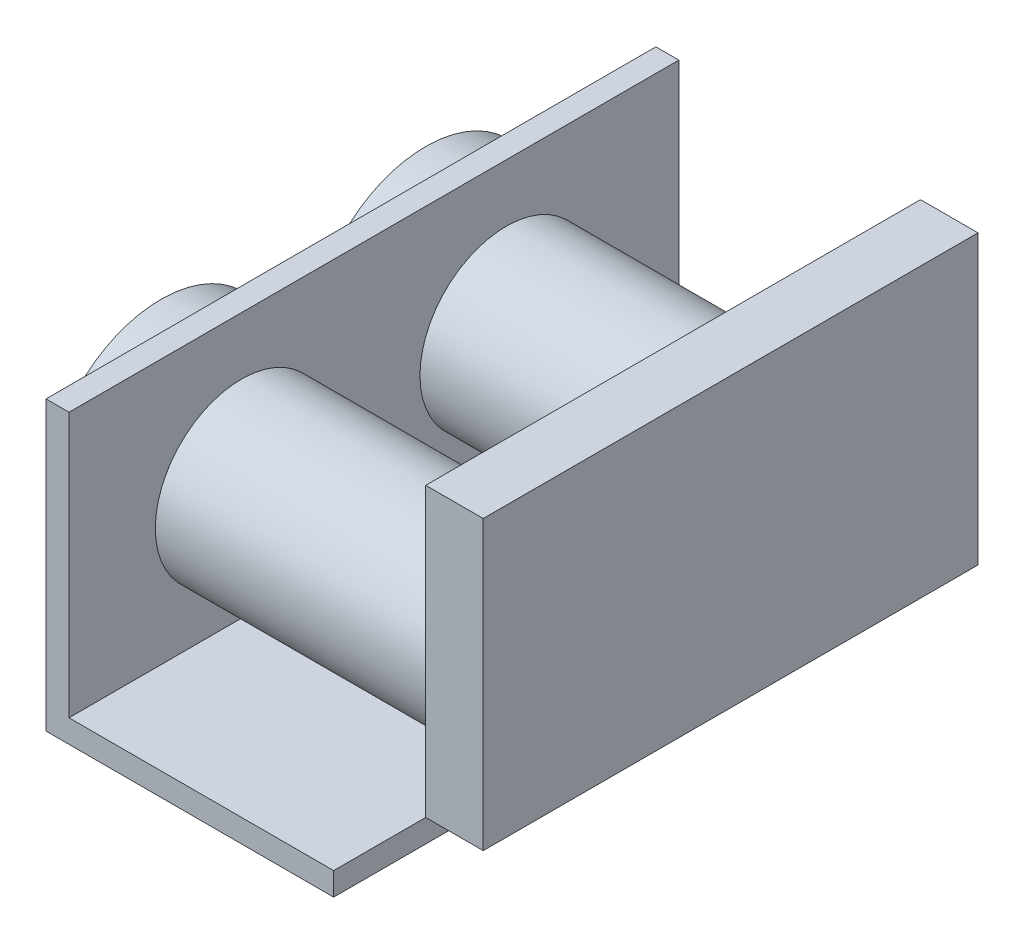
ISO-10303-21;
HEADER;
FILE_DESCRIPTION(('STEP AP214'),'2;1');
FILE_NAME('part.step','',(''),(''),'','','');
FILE_SCHEMA(('AUTOMOTIVE_DESIGN { 1 0 10303 214 1 1 1 1 }'));
ENDSEC;
DATA;
#1=APPLICATION_CONTEXT('core data for automotive mechanical design processes');
#2=APPLICATION_PROTOCOL_DEFINITION('international standard','automotive_design',2000,#1);
#3=PRODUCT_CONTEXT('',#1,'mechanical');
#4=PRODUCT('Part','Part','',(#3));
#5=PRODUCT_RELATED_PRODUCT_CATEGORY('part','',(#4));
#6=PRODUCT_DEFINITION_FORMATION('','',#4);
#7=PRODUCT_DEFINITION_CONTEXT('part definition',#1,'design');
#8=PRODUCT_DEFINITION('design','',#6,#7);
#9=PRODUCT_DEFINITION_SHAPE('','',#8);
#10=(LENGTH_UNIT() NAMED_UNIT(*) SI_UNIT(.MILLI.,.METRE.));
#11=(NAMED_UNIT(*) PLANE_ANGLE_UNIT() SI_UNIT($,.RADIAN.));
#12=(NAMED_UNIT(*) SI_UNIT($,.STERADIAN.) SOLID_ANGLE_UNIT());
#13=UNCERTAINTY_MEASURE_WITH_UNIT(LENGTH_MEASURE(1.E-05),#10,'distance_accuracy_value','');
#14=(GEOMETRIC_REPRESENTATION_CONTEXT(3) GLOBAL_UNCERTAINTY_ASSIGNED_CONTEXT((#13)) GLOBAL_UNIT_ASSIGNED_CONTEXT((#10,
#11,#12)) REPRESENTATION_CONTEXT('',''));
#15=CARTESIAN_POINT('',(0.,0.,0.));
#16=DIRECTION('',(0.,0.,1.));
#17=DIRECTION('',(1.,0.,0.));
#18=AXIS2_PLACEMENT_3D('',#15,#16,#17);
#19=CARTESIAN_POINT('',(0.,0.,53.));
#20=DIRECTION('',(-1.,0.,0.));
#21=DIRECTION('',(0.,0.,1.));
#22=AXIS2_PLACEMENT_3D('',#19,#20,#21);
#23=PLANE('',#22);
#24=CARTESIAN_POINT('',(0.,12.5,15.));
#25=DIRECTION('',(-1.,0.,0.));
#26=DIRECTION('',(0.,0.,1.));
#27=AXIS2_PLACEMENT_3D('',#24,#25,#26);
#28=CIRCLE('',#27,10.);
#29=CARTESIAN_POINT('',(0.,12.5,25.));
#30=VERTEX_POINT('',#29);
#31=EDGE_CURVE('E160',#30,#30,#28,.T.);
#32=ORIENTED_EDGE('',*,*,#31,.F.);
#33=EDGE_LOOP('',(#32));
#34=FACE_BOUND('',#33,.T.);
#35=DIRECTION('',(0.,1.,0.));
#36=VECTOR('',#35,1.);
#37=CARTESIAN_POINT('',(0.,0.,0.));
#38=LINE('',#37,#36);
#39=CARTESIAN_POINT('',(0.,0.,0.));
#40=VERTEX_POINT('',#39);
#41=CARTESIAN_POINT('',(0.,25.,0.));
#42=VERTEX_POINT('',#41);
#43=EDGE_CURVE('E192',#40,#42,#38,.T.);
#44=ORIENTED_EDGE('',*,*,#43,.F.);
#45=DIRECTION('',(0.,0.,-1.));
#46=VECTOR('',#45,1.);
#47=CARTESIAN_POINT('',(0.,0.,53.));
#48=LINE('',#47,#46);
#49=CARTESIAN_POINT('',(0.,0.,53.));
#50=VERTEX_POINT('',#49);
#51=EDGE_CURVE('E208',#50,#40,#48,.T.);
#52=ORIENTED_EDGE('',*,*,#51,.F.);
#53=DIRECTION('',(0.,1.,0.));
#54=VECTOR('',#53,1.);
#55=CARTESIAN_POINT('',(0.,0.,53.));
#56=LINE('',#55,#54);
#57=CARTESIAN_POINT('',(0.,25.,53.));
#58=VERTEX_POINT('',#57);
#59=EDGE_CURVE('E175',#50,#58,#56,.T.);
#60=ORIENTED_EDGE('',*,*,#59,.T.);
#61=DIRECTION('',(0.,0.,-1.));
#62=VECTOR('',#61,1.);
#63=CARTESIAN_POINT('',(0.,25.,53.));
#64=LINE('',#63,#62);
#65=EDGE_CURVE('E42',#58,#42,#64,.T.);
#66=ORIENTED_EDGE('',*,*,#65,.T.);
#67=EDGE_LOOP('',(#44,#52,#60,#66));
#68=FACE_BOUND('',#67,.T.);
#69=CARTESIAN_POINT('',(0.,12.5,38.));
#70=DIRECTION('',(-1.,0.,0.));
#71=DIRECTION('',(0.,0.,1.));
#72=AXIS2_PLACEMENT_3D('',#69,#70,#71);
#73=CIRCLE('',#72,10.);
#74=CARTESIAN_POINT('',(0.,12.5,48.));
#75=VERTEX_POINT('',#74);
#76=EDGE_CURVE('E156',#75,#75,#73,.T.);
#77=ORIENTED_EDGE('',*,*,#76,.F.);
#78=EDGE_LOOP('',(#77));
#79=FACE_BOUND('',#78,.T.);
#80=ADVANCED_FACE('F33',(#34,#68,#79),#23,.T.);
#81=CARTESIAN_POINT('',(2.,0.,53.));
#82=DIRECTION('',(-1.,0.,0.));
#83=DIRECTION('',(0.,0.,1.));
#84=AXIS2_PLACEMENT_3D('',#81,#82,#83);
#85=PLANE('',#84);
#86=CARTESIAN_POINT('',(2.,12.5,15.));
#87=DIRECTION('',(-1.,0.,0.));
#88=DIRECTION('',(0.,0.,1.));
#89=AXIS2_PLACEMENT_3D('',#86,#87,#88);
#90=CIRCLE('',#89,7.5);
#91=CARTESIAN_POINT('',(2.,12.5,22.5));
#92=VERTEX_POINT('',#91);
#93=EDGE_CURVE('E142',#92,#92,#90,.T.);
#94=ORIENTED_EDGE('',*,*,#93,.T.);
#95=EDGE_LOOP('',(#94));
#96=FACE_BOUND('',#95,.T.);
#97=CARTESIAN_POINT('',(2.,12.5,38.));
#98=DIRECTION('',(-1.,0.,0.));
#99=DIRECTION('',(0.,0.,1.));
#100=AXIS2_PLACEMENT_3D('',#97,#98,#99);
#101=CIRCLE('',#100,7.5);
#102=CARTESIAN_POINT('',(2.,12.5,45.5));
#103=VERTEX_POINT('',#102);
#104=EDGE_CURVE('E153',#103,#103,#101,.T.);
#105=ORIENTED_EDGE('',*,*,#104,.T.);
#106=EDGE_LOOP('',(#105));
#107=FACE_BOUND('',#106,.T.);
#108=DIRECTION('',(0.,1.,0.));
#109=VECTOR('',#108,1.);
#110=CARTESIAN_POINT('',(2.,0.,0.));
#111=LINE('',#110,#109);
#112=CARTESIAN_POINT('',(2.,2.,0.));
#113=VERTEX_POINT('',#112);
#114=CARTESIAN_POINT('',(2.,25.,0.));
#115=VERTEX_POINT('',#114);
#116=EDGE_CURVE('E166',#113,#115,#111,.T.);
#117=ORIENTED_EDGE('',*,*,#116,.T.);
#118=DIRECTION('',(0.,0.,-1.));
#119=VECTOR('',#118,1.);
#120=CARTESIAN_POINT('',(2.,25.,53.));
#121=LINE('',#120,#119);
#122=CARTESIAN_POINT('',(2.,25.,53.));
#123=VERTEX_POINT('',#122);
#124=EDGE_CURVE('E11',#123,#115,#121,.T.);
#125=ORIENTED_EDGE('',*,*,#124,.F.);
#126=DIRECTION('',(0.,1.,0.));
#127=VECTOR('',#126,1.);
#128=CARTESIAN_POINT('',(2.,0.,53.));
#129=LINE('',#128,#127);
#130=CARTESIAN_POINT('',(2.,2.,53.));
#131=VERTEX_POINT('',#130);
#132=EDGE_CURVE('E169',#131,#123,#129,.T.);
#133=ORIENTED_EDGE('',*,*,#132,.F.);
#134=DIRECTION('',(0.,0.,-1.));
#135=VECTOR('',#134,1.);
#136=CARTESIAN_POINT('',(2.,2.,53.));
#137=LINE('',#136,#135);
#138=EDGE_CURVE('E186',#131,#113,#137,.T.);
#139=ORIENTED_EDGE('',*,*,#138,.T.);
#140=EDGE_LOOP('',(#117,#125,#133,#139));
#141=FACE_BOUND('',#140,.T.);
#142=ADVANCED_FACE('F35',(#96,#107,#141),#85,.F.);
#143=CARTESIAN_POINT('',(0.,25.,53.));
#144=DIRECTION('',(0.,1.,0.));
#145=DIRECTION('',(0.,0.,1.));
#146=AXIS2_PLACEMENT_3D('',#143,#144,#145);
#147=PLANE('',#146);
#148=DIRECTION('',(1.,0.,0.));
#149=VECTOR('',#148,1.);
#150=CARTESIAN_POINT('',(0.,25.,0.));
#151=LINE('',#150,#149);
#152=EDGE_CURVE('E189',#42,#115,#151,.T.);
#153=ORIENTED_EDGE('',*,*,#152,.F.);
#154=ORIENTED_EDGE('',*,*,#65,.F.);
#155=DIRECTION('',(1.,0.,0.));
#156=VECTOR('',#155,1.);
#157=CARTESIAN_POINT('',(0.,25.,53.));
#158=LINE('',#157,#156);
#159=EDGE_CURVE('E171',#58,#123,#158,.T.);
#160=ORIENTED_EDGE('',*,*,#159,.T.);
#161=ORIENTED_EDGE('',*,*,#124,.T.);
#162=EDGE_LOOP('',(#153,#154,#160,#161));
#163=FACE_BOUND('',#162,.T.);
#164=ADVANCED_FACE('F217',(#163),#147,.T.);
#165=CARTESIAN_POINT('',(0.,0.,53.));
#166=DIRECTION('',(0.,-1.,0.));
#167=DIRECTION('',(0.,0.,-1.));
#168=AXIS2_PLACEMENT_3D('',#165,#166,#167);
#169=PLANE('',#168);
#170=CARTESIAN_POINT('',(15.,0.,26.5));
#171=DIRECTION('',(0.,-1.,0.));
#172=DIRECTION('',(0.,0.,-1.));
#173=AXIS2_PLACEMENT_3D('',#170,#171,#172);
#174=CIRCLE('',#173,1.5);
#175=CARTESIAN_POINT('',(15.,0.,25.));
#176=VERTEX_POINT('',#175);
#177=EDGE_CURVE('E268',#176,#176,#174,.T.);
#178=ORIENTED_EDGE('',*,*,#177,.F.);
#179=EDGE_LOOP('',(#178));
#180=FACE_BOUND('',#179,.T.);
#181=DIRECTION('',(-1.,0.,0.));
#182=VECTOR('',#181,1.);
#183=CARTESIAN_POINT('',(0.,0.,0.));
#184=LINE('',#183,#182);
#185=CARTESIAN_POINT('',(25.,0.,0.));
#186=VERTEX_POINT('',#185);
#187=EDGE_CURVE('E195',#186,#40,#184,.T.);
#188=ORIENTED_EDGE('',*,*,#187,.F.);
#189=DIRECTION('',(0.,0.,-1.));
#190=VECTOR('',#189,1.);
#191=CARTESIAN_POINT('',(25.,0.,53.));
#192=LINE('',#191,#190);
#193=CARTESIAN_POINT('',(25.,0.,53.));
#194=VERTEX_POINT('',#193);
#195=EDGE_CURVE('E206',#194,#186,#192,.T.);
#196=ORIENTED_EDGE('',*,*,#195,.F.);
#197=DIRECTION('',(-1.,0.,0.));
#198=VECTOR('',#197,1.);
#199=CARTESIAN_POINT('',(0.,0.,53.));
#200=LINE('',#199,#198);
#201=EDGE_CURVE('E178',#194,#50,#200,.T.);
#202=ORIENTED_EDGE('',*,*,#201,.T.);
#203=ORIENTED_EDGE('',*,*,#51,.T.);
#204=EDGE_LOOP('',(#188,#196,#202,#203));
#205=FACE_BOUND('',#204,.T.);
#206=ADVANCED_FACE('F226',(#180,#205),#169,.T.);
#207=CARTESIAN_POINT('',(25.,2.,53.));
#208=DIRECTION('',(1.,0.,0.));
#209=DIRECTION('',(0.,0.,-1.));
#210=AXIS2_PLACEMENT_3D('',#207,#208,#209);
#211=PLANE('',#210);
#212=DIRECTION('',(0.,-1.,0.));
#213=VECTOR('',#212,1.);
#214=CARTESIAN_POINT('',(25.,2.,0.));
#215=LINE('',#214,#213);
#216=CARTESIAN_POINT('',(25.,2.,0.));
#217=VERTEX_POINT('',#216);
#218=EDGE_CURVE('E198',#217,#186,#215,.T.);
#219=ORIENTED_EDGE('',*,*,#218,.F.);
#220=DIRECTION('',(0.,0.,-1.));
#221=VECTOR('',#220,1.);
#222=CARTESIAN_POINT('',(25.,2.,53.));
#223=LINE('',#222,#221);
#224=CARTESIAN_POINT('',(25.,2.,53.));
#225=VERTEX_POINT('',#224);
#226=EDGE_CURVE('E204',#225,#217,#223,.T.);
#227=ORIENTED_EDGE('',*,*,#226,.F.);
#228=DIRECTION('',(0.,-1.,0.));
#229=VECTOR('',#228,1.);
#230=CARTESIAN_POINT('',(25.,2.,53.));
#231=LINE('',#230,#229);
#232=EDGE_CURVE('E181',#225,#194,#231,.T.);
#233=ORIENTED_EDGE('',*,*,#232,.T.);
#234=ORIENTED_EDGE('',*,*,#195,.T.);
#235=EDGE_LOOP('',(#219,#227,#233,#234));
#236=FACE_BOUND('',#235,.T.);
#237=ADVANCED_FACE('F237',(#236),#211,.T.);
#238=CARTESIAN_POINT('',(0.,2.,53.));
#239=DIRECTION('',(0.,-1.,0.));
#240=DIRECTION('',(0.,0.,-1.));
#241=AXIS2_PLACEMENT_3D('',#238,#239,#240);
#242=PLANE('',#241);
#243=CARTESIAN_POINT('',(15.,2.,26.5));
#244=DIRECTION('',(0.,-1.,0.));
#245=DIRECTION('',(0.,0.,-1.));
#246=AXIS2_PLACEMENT_3D('',#243,#244,#245);
#247=CIRCLE('',#246,1.5);
#248=CARTESIAN_POINT('',(15.,2.,25.));
#249=VERTEX_POINT('',#248);
#250=EDGE_CURVE('E37',#249,#249,#247,.T.);
#251=ORIENTED_EDGE('',*,*,#250,.T.);
#252=EDGE_LOOP('',(#251));
#253=FACE_BOUND('',#252,.T.);
#254=DIRECTION('',(1.,0.,0.));
#255=VECTOR('',#254,1.);
#256=CARTESIAN_POINT('',(0.,2.,0.));
#257=LINE('',#256,#255);
#258=EDGE_CURVE('E172',#217,#113,#257,.F.);
#259=ORIENTED_EDGE('',*,*,#258,.T.);
#260=ORIENTED_EDGE('',*,*,#138,.F.);
#261=DIRECTION('',(1.,0.,0.));
#262=VECTOR('',#261,1.);
#263=CARTESIAN_POINT('',(0.,2.,53.));
#264=LINE('',#263,#262);
#265=EDGE_CURVE('E184',#225,#131,#264,.F.);
#266=ORIENTED_EDGE('',*,*,#265,.F.);
#267=ORIENTED_EDGE('',*,*,#226,.T.);
#268=EDGE_LOOP('',(#259,#260,#266,#267));
#269=FACE_BOUND('',#268,.T.);
#270=ADVANCED_FACE('F238',(#253,#269),#242,.F.);
#271=CARTESIAN_POINT('',(0.,0.,53.));
#272=DIRECTION('',(0.,0.,-1.));
#273=DIRECTION('',(-1.,0.,0.));
#274=AXIS2_PLACEMENT_3D('',#271,#272,#273);
#275=PLANE('',#274);
#276=ORIENTED_EDGE('',*,*,#132,.T.);
#277=ORIENTED_EDGE('',*,*,#159,.F.);
#278=ORIENTED_EDGE('',*,*,#59,.F.);
#279=ORIENTED_EDGE('',*,*,#201,.F.);
#280=ORIENTED_EDGE('',*,*,#232,.F.);
#281=ORIENTED_EDGE('',*,*,#265,.T.);
#282=EDGE_LOOP('',(#276,#277,#278,#279,#280,#281));
#283=FACE_BOUND('',#282,.T.);
#284=ADVANCED_FACE('F229',(#283),#275,.F.);
#285=CARTESIAN_POINT('',(0.,0.,0.));
#286=DIRECTION('',(0.,0.,-1.));
#287=DIRECTION('',(-1.,0.,0.));
#288=AXIS2_PLACEMENT_3D('',#285,#286,#287);
#289=PLANE('',#288);
#290=ORIENTED_EDGE('',*,*,#116,.F.);
#291=ORIENTED_EDGE('',*,*,#258,.F.);
#292=ORIENTED_EDGE('',*,*,#218,.T.);
#293=ORIENTED_EDGE('',*,*,#187,.T.);
#294=ORIENTED_EDGE('',*,*,#43,.T.);
#295=ORIENTED_EDGE('',*,*,#152,.T.);
#296=EDGE_LOOP('',(#290,#291,#292,#293,#294,#295));
#297=FACE_BOUND('',#296,.T.);
#298=ADVANCED_FACE('F221',(#297),#289,.T.);
#299=CARTESIAN_POINT('',(-5.,12.5,15.));
#300=DIRECTION('',(1.,0.,0.));
#301=DIRECTION('',(0.,0.,-1.));
#302=AXIS2_PLACEMENT_3D('',#299,#300,#301);
#303=CYLINDRICAL_SURFACE('',#302,10.);
#304=CARTESIAN_POINT('',(-5.,12.5,15.));
#305=DIRECTION('',(-1.,0.,0.));
#306=DIRECTION('',(0.,0.,1.));
#307=AXIS2_PLACEMENT_3D('',#304,#305,#306);
#308=CIRCLE('',#307,10.);
#309=CARTESIAN_POINT('',(-5.,12.5,25.));
#310=VERTEX_POINT('',#309);
#311=EDGE_CURVE('E163',#310,#310,#308,.T.);
#312=ORIENTED_EDGE('',*,*,#311,.F.);
#313=EDGE_LOOP('',(#312));
#314=FACE_BOUND('',#313,.T.);
#315=ORIENTED_EDGE('',*,*,#31,.T.);
#316=EDGE_LOOP('',(#315));
#317=FACE_BOUND('',#316,.T.);
#318=ADVANCED_FACE('F316',(#314,#317),#303,.T.);
#319=CARTESIAN_POINT('',(-5.,12.5,15.));
#320=DIRECTION('',(-1.,0.,0.));
#321=DIRECTION('',(0.,0.,1.));
#322=AXIS2_PLACEMENT_3D('',#319,#320,#321);
#323=PLANE('',#322);
#324=ORIENTED_EDGE('',*,*,#311,.T.);
#325=EDGE_LOOP('',(#324));
#326=FACE_BOUND('',#325,.T.);
#327=ADVANCED_FACE('F312',(#326),#323,.T.);
#328=CARTESIAN_POINT('',(-5.,12.5,38.));
#329=DIRECTION('',(1.,0.,0.));
#330=DIRECTION('',(0.,0.,-1.));
#331=AXIS2_PLACEMENT_3D('',#328,#329,#330);
#332=CYLINDRICAL_SURFACE('',#331,10.);
#333=CARTESIAN_POINT('',(-5.,12.5,38.));
#334=DIRECTION('',(-1.,0.,0.));
#335=DIRECTION('',(0.,0.,1.));
#336=AXIS2_PLACEMENT_3D('',#333,#334,#335);
#337=CIRCLE('',#336,10.);
#338=CARTESIAN_POINT('',(-5.,12.5,48.));
#339=VERTEX_POINT('',#338);
#340=EDGE_CURVE('E157',#339,#339,#337,.T.);
#341=ORIENTED_EDGE('',*,*,#340,.F.);
#342=EDGE_LOOP('',(#341));
#343=FACE_BOUND('',#342,.T.);
#344=ORIENTED_EDGE('',*,*,#76,.T.);
#345=EDGE_LOOP('',(#344));
#346=FACE_BOUND('',#345,.T.);
#347=ADVANCED_FACE('F305',(#343,#346),#332,.T.);
#348=CARTESIAN_POINT('',(-5.,12.5,38.));
#349=DIRECTION('',(-1.,0.,0.));
#350=DIRECTION('',(0.,0.,1.));
#351=AXIS2_PLACEMENT_3D('',#348,#349,#350);
#352=PLANE('',#351);
#353=ORIENTED_EDGE('',*,*,#340,.T.);
#354=EDGE_LOOP('',(#353));
#355=FACE_BOUND('',#354,.T.);
#356=ADVANCED_FACE('F295',(#355),#352,.T.);
#357=CARTESIAN_POINT('',(28.,12.5,38.));
#358=DIRECTION('',(-1.,0.,0.));
#359=DIRECTION('',(0.,0.,1.));
#360=AXIS2_PLACEMENT_3D('',#357,#358,#359);
#361=CYLINDRICAL_SURFACE('',#360,7.5);
#362=CARTESIAN_POINT('',(28.,12.5,38.));
#363=DIRECTION('',(-1.,0.,0.));
#364=DIRECTION('',(0.,0.,1.));
#365=AXIS2_PLACEMENT_3D('',#362,#363,#364);
#366=CIRCLE('',#365,7.5);
#367=CARTESIAN_POINT('',(28.,4.99999999999999,38.));
#368=VERTEX_POINT('',#367);
#369=EDGE_CURVE('E150',#368,#368,#366,.T.);
#370=ORIENTED_EDGE('',*,*,#369,.T.);
#371=EDGE_LOOP('',(#370));
#372=FACE_BOUND('',#371,.T.);
#373=ORIENTED_EDGE('',*,*,#104,.F.);
#374=EDGE_LOOP('',(#373));
#375=FACE_BOUND('',#374,.T.);
#376=ADVANCED_FACE('F291',(#372,#375),#361,.T.);
#377=CARTESIAN_POINT('',(28.,12.5,15.));
#378=DIRECTION('',(-1.,0.,0.));
#379=DIRECTION('',(0.,0.,1.));
#380=AXIS2_PLACEMENT_3D('',#377,#378,#379);
#381=CYLINDRICAL_SURFACE('',#380,7.5);
#382=CARTESIAN_POINT('',(28.,12.5,15.));
#383=DIRECTION('',(-1.,0.,0.));
#384=DIRECTION('',(0.,0.,1.));
#385=AXIS2_PLACEMENT_3D('',#382,#383,#384);
#386=CIRCLE('',#385,7.5);
#387=CARTESIAN_POINT('',(28.,5.,15.));
#388=VERTEX_POINT('',#387);
#389=EDGE_CURVE('E139',#388,#388,#386,.T.);
#390=ORIENTED_EDGE('',*,*,#389,.T.);
#391=EDGE_LOOP('',(#390));
#392=FACE_BOUND('',#391,.T.);
#393=ORIENTED_EDGE('',*,*,#93,.F.);
#394=EDGE_LOOP('',(#393));
#395=FACE_BOUND('',#394,.T.);
#396=ADVANCED_FACE('F294',(#392,#395),#381,.T.);
#397=CARTESIAN_POINT('',(33.,30.,4.99999999999999));
#398=DIRECTION('',(0.,0.,1.));
#399=DIRECTION('',(0.,-1.,0.));
#400=AXIS2_PLACEMENT_3D('',#397,#398,#399);
#401=PLANE('',#400);
#402=DIRECTION('',(0.,1.,0.));
#403=VECTOR('',#402,1.);
#404=CARTESIAN_POINT('',(28.,30.,4.99999999999999));
#405=LINE('',#404,#403);
#406=CARTESIAN_POINT('',(28.,5.,5.));
#407=VERTEX_POINT('',#406);
#408=CARTESIAN_POINT('',(28.,30.,4.99999999999999));
#409=VERTEX_POINT('',#408);
#410=EDGE_CURVE('E138',#407,#409,#405,.T.);
#411=ORIENTED_EDGE('',*,*,#410,.T.);
#412=DIRECTION('',(-1.,0.,0.));
#413=VECTOR('',#412,1.);
#414=CARTESIAN_POINT('',(33.,30.,4.99999999999999));
#415=LINE('',#414,#413);
#416=CARTESIAN_POINT('',(33.,30.,4.99999999999999));
#417=VERTEX_POINT('',#416);
#418=EDGE_CURVE('E119',#417,#409,#415,.T.);
#419=ORIENTED_EDGE('',*,*,#418,.F.);
#420=DIRECTION('',(0.,1.,0.));
#421=VECTOR('',#420,1.);
#422=CARTESIAN_POINT('',(33.,30.,4.99999999999999));
#423=LINE('',#422,#421);
#424=CARTESIAN_POINT('',(33.,5.,5.));
#425=VERTEX_POINT('',#424);
#426=EDGE_CURVE('E126',#425,#417,#423,.T.);
#427=ORIENTED_EDGE('',*,*,#426,.F.);
#428=DIRECTION('',(-1.,0.,0.));
#429=VECTOR('',#428,1.);
#430=CARTESIAN_POINT('',(33.,5.,5.));
#431=LINE('',#430,#429);
#432=EDGE_CURVE('E274',#425,#407,#431,.T.);
#433=ORIENTED_EDGE('',*,*,#432,.T.);
#434=EDGE_LOOP('',(#411,#419,#427,#433));
#435=FACE_BOUND('',#434,.T.);
#436=ADVANCED_FACE('F136',(#435),#401,.F.);
#437=CARTESIAN_POINT('',(33.,30.,48.));
#438=DIRECTION('',(0.,-1.,0.));
#439=DIRECTION('',(0.,0.,-1.));
#440=AXIS2_PLACEMENT_3D('',#437,#438,#439);
#441=PLANE('',#440);
#442=DIRECTION('',(0.,0.,1.));
#443=VECTOR('',#442,1.);
#444=CARTESIAN_POINT('',(28.,30.,48.));
#445=LINE('',#444,#443);
#446=CARTESIAN_POINT('',(28.,30.,48.));
#447=VERTEX_POINT('',#446);
#448=EDGE_CURVE('E276',#409,#447,#445,.T.);
#449=ORIENTED_EDGE('',*,*,#448,.T.);
#450=DIRECTION('',(-1.,0.,0.));
#451=VECTOR('',#450,1.);
#452=CARTESIAN_POINT('',(33.,30.,48.));
#453=LINE('',#452,#451);
#454=CARTESIAN_POINT('',(33.,30.,48.));
#455=VERTEX_POINT('',#454);
#456=EDGE_CURVE('E122',#455,#447,#453,.T.);
#457=ORIENTED_EDGE('',*,*,#456,.F.);
#458=DIRECTION('',(0.,0.,1.));
#459=VECTOR('',#458,1.);
#460=CARTESIAN_POINT('',(33.,30.,48.));
#461=LINE('',#460,#459);
#462=EDGE_CURVE('E115',#417,#455,#461,.T.);
#463=ORIENTED_EDGE('',*,*,#462,.F.);
#464=ORIENTED_EDGE('',*,*,#418,.T.);
#465=EDGE_LOOP('',(#449,#457,#463,#464));
#466=FACE_BOUND('',#465,.T.);
#467=ADVANCED_FACE('F117',(#466),#441,.F.);
#468=CARTESIAN_POINT('',(33.,30.,48.));
#469=DIRECTION('',(0.,0.,-1.));
#470=DIRECTION('',(0.,1.,0.));
#471=AXIS2_PLACEMENT_3D('',#468,#469,#470);
#472=PLANE('',#471);
#473=DIRECTION('',(0.,-1.,0.));
#474=VECTOR('',#473,1.);
#475=CARTESIAN_POINT('',(28.,30.,48.));
#476=LINE('',#475,#474);
#477=CARTESIAN_POINT('',(28.,4.99999999999999,48.));
#478=VERTEX_POINT('',#477);
#479=EDGE_CURVE('E278',#447,#478,#476,.T.);
#480=ORIENTED_EDGE('',*,*,#479,.T.);
#481=DIRECTION('',(-1.,0.,0.));
#482=VECTOR('',#481,1.);
#483=CARTESIAN_POINT('',(33.,4.99999999999999,48.));
#484=LINE('',#483,#482);
#485=CARTESIAN_POINT('',(33.,4.99999999999999,48.));
#486=VERTEX_POINT('',#485);
#487=EDGE_CURVE('E144',#486,#478,#484,.T.);
#488=ORIENTED_EDGE('',*,*,#487,.F.);
#489=DIRECTION('',(0.,-1.,0.));
#490=VECTOR('',#489,1.);
#491=CARTESIAN_POINT('',(33.,30.,48.));
#492=LINE('',#491,#490);
#493=EDGE_CURVE('E125',#455,#486,#492,.T.);
#494=ORIENTED_EDGE('',*,*,#493,.F.);
#495=ORIENTED_EDGE('',*,*,#456,.T.);
#496=EDGE_LOOP('',(#480,#488,#494,#495));
#497=FACE_BOUND('',#496,.T.);
#498=ADVANCED_FACE('F368',(#497),#472,.F.);
#499=CARTESIAN_POINT('',(33.,4.99999999999999,48.));
#500=DIRECTION('',(0.,1.,0.));
#501=DIRECTION('',(0.,0.,1.));
#502=AXIS2_PLACEMENT_3D('',#499,#500,#501);
#503=PLANE('',#502);
#504=DIRECTION('',(0.,0.,-1.));
#505=VECTOR('',#504,1.);
#506=CARTESIAN_POINT('',(28.,4.99999999999999,48.));
#507=LINE('',#506,#505);
#508=EDGE_CURVE('E49',#478,#368,#507,.T.);
#509=ORIENTED_EDGE('',*,*,#508,.T.);
#510=EDGE_CURVE('E53',#368,#388,#507,.T.);
#511=ORIENTED_EDGE('',*,*,#510,.T.);
#512=EDGE_CURVE('E280',#388,#407,#507,.T.);
#513=ORIENTED_EDGE('',*,*,#512,.T.);
#514=ORIENTED_EDGE('',*,*,#432,.F.);
#515=DIRECTION('',(0.,0.,-1.));
#516=VECTOR('',#515,1.);
#517=CARTESIAN_POINT('',(33.,4.99999999999999,48.));
#518=LINE('',#517,#516);
#519=EDGE_CURVE('E131',#486,#425,#518,.T.);
#520=ORIENTED_EDGE('',*,*,#519,.F.);
#521=ORIENTED_EDGE('',*,*,#487,.T.);
#522=EDGE_LOOP('',(#509,#511,#513,#514,#520,#521));
#523=FACE_BOUND('',#522,.T.);
#524=ADVANCED_FACE('F283',(#523),#503,.F.);
#525=CARTESIAN_POINT('',(33.,0.,0.));
#526=DIRECTION('',(1.,0.,0.));
#527=DIRECTION('',(0.,0.,-1.));
#528=AXIS2_PLACEMENT_3D('',#525,#526,#527);
#529=PLANE('',#528);
#530=ORIENTED_EDGE('',*,*,#426,.T.);
#531=ORIENTED_EDGE('',*,*,#462,.T.);
#532=ORIENTED_EDGE('',*,*,#493,.T.);
#533=ORIENTED_EDGE('',*,*,#519,.T.);
#534=EDGE_LOOP('',(#530,#531,#532,#533));
#535=FACE_BOUND('',#534,.T.);
#536=ADVANCED_FACE('F129',(#535),#529,.T.);
#537=CARTESIAN_POINT('',(28.,0.,0.));
#538=DIRECTION('',(1.,0.,0.));
#539=DIRECTION('',(0.,0.,-1.));
#540=AXIS2_PLACEMENT_3D('',#537,#538,#539);
#541=PLANE('',#540);
#542=ORIENTED_EDGE('',*,*,#510,.F.);
#543=ORIENTED_EDGE('',*,*,#369,.F.);
#544=ORIENTED_EDGE('',*,*,#508,.F.);
#545=ORIENTED_EDGE('',*,*,#479,.F.);
#546=ORIENTED_EDGE('',*,*,#448,.F.);
#547=ORIENTED_EDGE('',*,*,#410,.F.);
#548=ORIENTED_EDGE('',*,*,#512,.F.);
#549=ORIENTED_EDGE('',*,*,#389,.F.);
#550=EDGE_LOOP('',(#542,#543,#544,#545,#546,#547,#548,#549));
#551=FACE_BOUND('',#550,.T.);
#552=ADVANCED_FACE('F288',(#551),#541,.F.);
#553=CARTESIAN_POINT('',(15.,5.,26.5));
#554=DIRECTION('',(0.,-1.,0.));
#555=DIRECTION('',(0.,0.,-1.));
#556=AXIS2_PLACEMENT_3D('',#553,#554,#555);
#557=CYLINDRICAL_SURFACE('',#556,1.5);
#558=ORIENTED_EDGE('',*,*,#177,.T.);
#559=EDGE_LOOP('',(#558));
#560=FACE_BOUND('',#559,.T.);
#561=ORIENTED_EDGE('',*,*,#250,.F.);
#562=EDGE_LOOP('',(#561));
#563=FACE_BOUND('',#562,.T.);
#564=ADVANCED_FACE('F400',(#560,#563),#557,.F.);
#565=CLOSED_SHELL('',(#80,#142,#164,#206,#237,#270,#284,#298,#318,#327,#347,#356,#376,#396,#436,
#467,#498,#524,#536,#552,#564));
#566=MANIFOLD_SOLID_BREP('B2',#565);
#567=ADVANCED_BREP_SHAPE_REPRESENTATION('',(#18,#566),#14);
#568=SHAPE_DEFINITION_REPRESENTATION(#9,#567);
ENDSEC;
END-ISO-10303-21;
